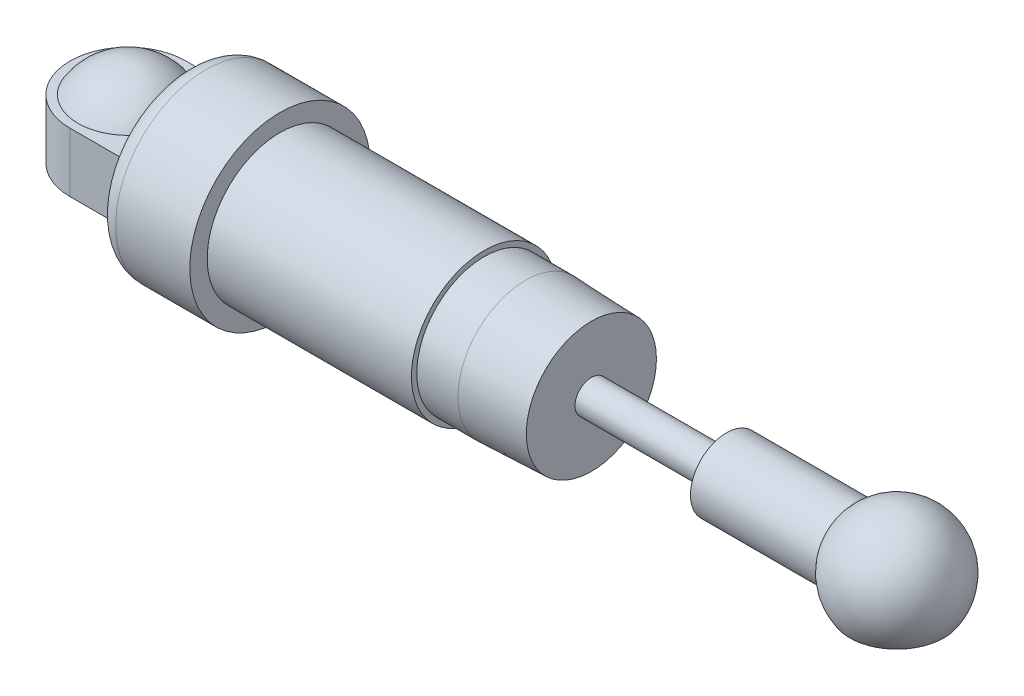
ISO-10303-21;
HEADER;
FILE_DESCRIPTION(('STEP AP214'),'2;1');
FILE_NAME('part.step','',(''),(''),'','','');
FILE_SCHEMA(('AUTOMOTIVE_DESIGN { 1 0 10303 214 1 1 1 1 }'));
ENDSEC;
DATA;
#1=APPLICATION_CONTEXT('core data for automotive mechanical design processes');
#2=APPLICATION_PROTOCOL_DEFINITION('international standard','automotive_design',2000,#1);
#3=PRODUCT_CONTEXT('',#1,'mechanical');
#4=PRODUCT('Part','Part','',(#3));
#5=PRODUCT_RELATED_PRODUCT_CATEGORY('part','',(#4));
#6=PRODUCT_DEFINITION_FORMATION('','',#4);
#7=PRODUCT_DEFINITION_CONTEXT('part definition',#1,'design');
#8=PRODUCT_DEFINITION('design','',#6,#7);
#9=PRODUCT_DEFINITION_SHAPE('','',#8);
#10=(LENGTH_UNIT() NAMED_UNIT(*) SI_UNIT(.MILLI.,.METRE.));
#11=(NAMED_UNIT(*) PLANE_ANGLE_UNIT() SI_UNIT($,.RADIAN.));
#12=(NAMED_UNIT(*) SI_UNIT($,.STERADIAN.) SOLID_ANGLE_UNIT());
#13=UNCERTAINTY_MEASURE_WITH_UNIT(LENGTH_MEASURE(1.E-05),#10,'distance_accuracy_value','');
#14=(GEOMETRIC_REPRESENTATION_CONTEXT(3) GLOBAL_UNCERTAINTY_ASSIGNED_CONTEXT((#13)) GLOBAL_UNIT_ASSIGNED_CONTEXT((#10,
#11,#12)) REPRESENTATION_CONTEXT('',''));
#15=CARTESIAN_POINT('',(0.,0.,0.));
#16=DIRECTION('',(0.,0.,1.));
#17=DIRECTION('',(1.,0.,0.));
#18=AXIS2_PLACEMENT_3D('',#15,#16,#17);
#19=CARTESIAN_POINT('',(-28.125,1.8,0.));
#20=DIRECTION('',(0.,1.,0.));
#21=DIRECTION('',(0.,0.,1.));
#22=AXIS2_PLACEMENT_3D('',#19,#20,#21);
#23=PLANE('',#22);
#24=DIRECTION('',(0.,0.,-1.));
#25=VECTOR('',#24,1.);
#26=CARTESIAN_POINT('',(-24.6,1.8,-3.525));
#27=LINE('',#26,#25);
#28=CARTESIAN_POINT('',(-24.6,1.8,3.525));
#29=VERTEX_POINT('',#28);
#30=CARTESIAN_POINT('',(-24.6,1.8,-3.525));
#31=VERTEX_POINT('',#30);
#32=EDGE_CURVE('E104',#29,#31,#27,.T.);
#33=ORIENTED_EDGE('',*,*,#32,.T.);
#34=DIRECTION('',(-1.,0.,0.));
#35=VECTOR('',#34,1.);
#36=CARTESIAN_POINT('',(-24.6,1.8,-3.525));
#37=LINE('',#36,#35);
#38=CARTESIAN_POINT('',(-28.125,1.8,-3.525));
#39=VERTEX_POINT('',#38);
#40=EDGE_CURVE('E107',#31,#39,#37,.T.);
#41=ORIENTED_EDGE('',*,*,#40,.T.);
#42=CARTESIAN_POINT('',(-28.125,1.8,0.));
#43=DIRECTION('',(0.,1.,0.));
#44=DIRECTION('',(0.,0.,1.));
#45=AXIS2_PLACEMENT_3D('',#42,#43,#44);
#46=CIRCLE('',#45,3.525);
#47=CARTESIAN_POINT('',(-28.125,1.8,3.525));
#48=VERTEX_POINT('',#47);
#49=EDGE_CURVE('E110',#39,#48,#46,.T.);
#50=ORIENTED_EDGE('',*,*,#49,.T.);
#51=DIRECTION('',(1.,0.,0.));
#52=VECTOR('',#51,1.);
#53=CARTESIAN_POINT('',(-24.6,1.8,3.525));
#54=LINE('',#53,#52);
#55=EDGE_CURVE('E112',#48,#29,#54,.T.);
#56=ORIENTED_EDGE('',*,*,#55,.T.);
#57=EDGE_LOOP('',(#33,#41,#50,#56));
#58=FACE_BOUND('',#57,.T.);
#59=CARTESIAN_POINT('',(-28.125,1.8,0.));
#60=DIRECTION('',(0.,1.,0.));
#61=DIRECTION('',(0.,0.,1.));
#62=AXIS2_PLACEMENT_3D('',#59,#60,#61);
#63=CIRCLE('',#62,3.03077960267651);
#64=CARTESIAN_POINT('',(-28.125,1.8,3.03077960267651));
#65=VERTEX_POINT('',#64);
#66=EDGE_CURVE('E39',#65,#65,#63,.F.);
#67=ORIENTED_EDGE('',*,*,#66,.T.);
#68=EDGE_LOOP('',(#67));
#69=FACE_BOUND('',#68,.T.);
#70=ADVANCED_FACE('F35',(#58,#69),#23,.T.);
#71=CARTESIAN_POINT('',(18.5394063644432,0.,0.));
#72=DIRECTION('',(-1.,0.,0.));
#73=DIRECTION('',(0.,1.,0.));
#74=AXIS2_PLACEMENT_3D('',#71,#72,#73);
#75=SPHERICAL_SURFACE('',#74,3.49);
#76=CARTESIAN_POINT('',(15.8140256570924,0.,0.));
#77=DIRECTION('',(-1.,0.,0.));
#78=DIRECTION('',(0.,0.,1.));
#79=AXIS2_PLACEMENT_3D('',#76,#77,#78);
#80=CIRCLE('',#79,2.18);
#81=CARTESIAN_POINT('',(15.8140256570924,-2.,0.867409937688057));
#82=VERTEX_POINT('',#81);
#83=CARTESIAN_POINT('',(15.8140256570924,-2.,-0.867409937688057));
#84=VERTEX_POINT('',#83);
#85=EDGE_CURVE('E147',#82,#84,#80,.T.);
#86=ORIENTED_EDGE('',*,*,#85,.F.);
#87=CARTESIAN_POINT('',(18.5394063644432,-2.,0.));
#88=DIRECTION('',(0.,-1.,0.));
#89=DIRECTION('',(1.,0.,0.));
#90=AXIS2_PLACEMENT_3D('',#87,#88,#89);
#91=CIRCLE('',#90,2.86008741125162);
#92=EDGE_CURVE('E11',#84,#82,#91,.T.);
#93=ORIENTED_EDGE('',*,*,#92,.F.);
#94=EDGE_LOOP('',(#86,#93));
#95=FACE_BOUND('',#94,.T.);
#96=ADVANCED_FACE('F180',(#95),#75,.T.);
#97=CARTESIAN_POINT('',(0.,0.,0.));
#98=DIRECTION('',(-1.,0.,0.));
#99=DIRECTION('',(0.,0.,1.));
#100=AXIS2_PLACEMENT_3D('',#97,#98,#99);
#101=CYLINDRICAL_SURFACE('',#100,2.18);
#102=CARTESIAN_POINT('',(8.19402565709242,0.,0.));
#103=DIRECTION('',(-1.,0.,0.));
#104=DIRECTION('',(0.,0.,1.));
#105=AXIS2_PLACEMENT_3D('',#102,#103,#104);
#106=CIRCLE('',#105,2.18);
#107=CARTESIAN_POINT('',(8.19402565709242,0.,2.18));
#108=VERTEX_POINT('',#107);
#109=EDGE_CURVE('E144',#108,#108,#106,.T.);
#110=ORIENTED_EDGE('',*,*,#109,.F.);
#111=EDGE_LOOP('',(#110));
#112=FACE_BOUND('',#111,.T.);
#113=ORIENTED_EDGE('',*,*,#85,.T.);
#114=CARTESIAN_POINT('',(38.1740256953523,0.,0.));
#115=DIRECTION('',(0.0890897673610199,-0.996023600800483,0.));
#116=DIRECTION('',(-0.996023600800483,-0.0890897673610199,0.));
#117=AXIS2_PLACEMENT_3D('',#114,#115,#116);
#118=ELLIPSE('',#117,24.4697013425341,2.18);
#119=EDGE_CURVE('E44',#82,#84,#118,.T.);
#120=ORIENTED_EDGE('',*,*,#119,.F.);
#121=EDGE_LOOP('',(#113,#120));
#122=FACE_BOUND('',#121,.T.);
#123=ADVANCED_FACE('F181',(#112,#122),#101,.T.);
#124=CARTESIAN_POINT('',(0.,3.95,0.));
#125=DIRECTION('',(1.,0.,0.));
#126=DIRECTION('',(0.,0.,-1.));
#127=AXIS2_PLACEMENT_3D('',#124,#125,#126);
#128=PLANE('',#127);
#129=CARTESIAN_POINT('',(0.,0.,0.));
#130=DIRECTION('',(1.,0.,0.));
#131=DIRECTION('',(0.,0.,-1.));
#132=AXIS2_PLACEMENT_3D('',#129,#130,#131);
#133=CIRCLE('',#132,3.95);
#134=CARTESIAN_POINT('',(0.,0.,-3.95));
#135=VERTEX_POINT('',#134);
#136=EDGE_CURVE('E171',#135,#135,#133,.T.);
#137=ORIENTED_EDGE('',*,*,#136,.T.);
#138=EDGE_LOOP('',(#137));
#139=FACE_BOUND('',#138,.T.);
#140=CARTESIAN_POINT('',(0.,0.,0.));
#141=DIRECTION('',(-1.,0.,0.));
#142=DIRECTION('',(0.,0.,1.));
#143=AXIS2_PLACEMENT_3D('',#140,#141,#142);
#144=CIRCLE('',#143,0.995);
#145=CARTESIAN_POINT('',(0.,0.,0.995));
#146=VERTEX_POINT('',#145);
#147=EDGE_CURVE('E138',#146,#146,#144,.T.);
#148=ORIENTED_EDGE('',*,*,#147,.T.);
#149=EDGE_LOOP('',(#148));
#150=FACE_BOUND('',#149,.T.);
#151=ADVANCED_FACE('F37',(#139,#150),#128,.T.);
#152=CARTESIAN_POINT('',(0.,0.,0.));
#153=DIRECTION('',(-1.,0.,0.));
#154=DIRECTION('',(0.,0.,1.));
#155=AXIS2_PLACEMENT_3D('',#152,#153,#154);
#156=CONICAL_SURFACE('',#155,3.95,0.037482436691661);
#157=CARTESIAN_POINT('',(-4.,0.,0.));
#158=DIRECTION('',(1.,0.,0.));
#159=DIRECTION('',(0.,0.,-1.));
#160=AXIS2_PLACEMENT_3D('',#157,#158,#159);
#161=CIRCLE('',#160,4.1);
#162=CARTESIAN_POINT('',(-4.,0.,-4.1));
#163=VERTEX_POINT('',#162);
#164=EDGE_CURVE('E168',#163,#163,#161,.T.);
#165=ORIENTED_EDGE('',*,*,#164,.T.);
#166=EDGE_LOOP('',(#165));
#167=FACE_BOUND('',#166,.T.);
#168=ORIENTED_EDGE('',*,*,#136,.F.);
#169=EDGE_LOOP('',(#168));
#170=FACE_BOUND('',#169,.T.);
#171=ADVANCED_FACE('F337',(#167,#170),#156,.T.);
#172=CARTESIAN_POINT('',(0.,0.,0.));
#173=DIRECTION('',(1.,0.,0.));
#174=DIRECTION('',(0.,0.,-1.));
#175=AXIS2_PLACEMENT_3D('',#172,#173,#174);
#176=CYLINDRICAL_SURFACE('',#175,4.1);
#177=CARTESIAN_POINT('',(-6.5,0.,0.));
#178=DIRECTION('',(1.,0.,0.));
#179=DIRECTION('',(0.,0.,-1.));
#180=AXIS2_PLACEMENT_3D('',#177,#178,#179);
#181=CIRCLE('',#180,4.1);
#182=CARTESIAN_POINT('',(-6.5,0.,-4.1));
#183=VERTEX_POINT('',#182);
#184=EDGE_CURVE('E165',#183,#183,#181,.T.);
#185=ORIENTED_EDGE('',*,*,#184,.T.);
#186=EDGE_LOOP('',(#185));
#187=FACE_BOUND('',#186,.T.);
#188=ORIENTED_EDGE('',*,*,#164,.F.);
#189=EDGE_LOOP('',(#188));
#190=FACE_BOUND('',#189,.T.);
#191=ADVANCED_FACE('F390',(#187,#190),#176,.T.);
#192=CARTESIAN_POINT('',(-6.5,4.42,0.));
#193=DIRECTION('',(1.,0.,0.));
#194=DIRECTION('',(0.,0.,-1.));
#195=AXIS2_PLACEMENT_3D('',#192,#193,#194);
#196=PLANE('',#195);
#197=CARTESIAN_POINT('',(-6.5,0.,0.));
#198=DIRECTION('',(1.,0.,0.));
#199=DIRECTION('',(0.,0.,-1.));
#200=AXIS2_PLACEMENT_3D('',#197,#198,#199);
#201=CIRCLE('',#200,4.42);
#202=CARTESIAN_POINT('',(-6.5,0.,-4.42));
#203=VERTEX_POINT('',#202);
#204=EDGE_CURVE('E162',#203,#203,#201,.T.);
#205=ORIENTED_EDGE('',*,*,#204,.T.);
#206=EDGE_LOOP('',(#205));
#207=FACE_BOUND('',#206,.T.);
#208=ORIENTED_EDGE('',*,*,#184,.F.);
#209=EDGE_LOOP('',(#208));
#210=FACE_BOUND('',#209,.T.);
#211=ADVANCED_FACE('F380',(#207,#210),#196,.T.);
#212=CARTESIAN_POINT('',(0.,0.,0.));
#213=DIRECTION('',(1.,0.,0.));
#214=DIRECTION('',(0.,0.,-1.));
#215=AXIS2_PLACEMENT_3D('',#212,#213,#214);
#216=CYLINDRICAL_SURFACE('',#215,4.42);
#217=CARTESIAN_POINT('',(-18.9,0.,0.));
#218=DIRECTION('',(1.,0.,0.));
#219=DIRECTION('',(0.,0.,-1.));
#220=AXIS2_PLACEMENT_3D('',#217,#218,#219);
#221=CIRCLE('',#220,4.42);
#222=CARTESIAN_POINT('',(-18.9,0.,-4.42));
#223=VERTEX_POINT('',#222);
#224=EDGE_CURVE('E159',#223,#223,#221,.T.);
#225=ORIENTED_EDGE('',*,*,#224,.T.);
#226=EDGE_LOOP('',(#225));
#227=FACE_BOUND('',#226,.T.);
#228=ORIENTED_EDGE('',*,*,#204,.F.);
#229=EDGE_LOOP('',(#228));
#230=FACE_BOUND('',#229,.T.);
#231=ADVANCED_FACE('F371',(#227,#230),#216,.T.);
#232=CARTESIAN_POINT('',(-18.9,5.475,0.));
#233=DIRECTION('',(1.,0.,0.));
#234=DIRECTION('',(0.,0.,-1.));
#235=AXIS2_PLACEMENT_3D('',#232,#233,#234);
#236=PLANE('',#235);
#237=CARTESIAN_POINT('',(-18.9,0.,0.));
#238=DIRECTION('',(1.,0.,0.));
#239=DIRECTION('',(0.,0.,-1.));
#240=AXIS2_PLACEMENT_3D('',#237,#238,#239);
#241=CIRCLE('',#240,5.475);
#242=CARTESIAN_POINT('',(-18.9,0.,-5.475));
#243=VERTEX_POINT('',#242);
#244=EDGE_CURVE('E156',#243,#243,#241,.T.);
#245=ORIENTED_EDGE('',*,*,#244,.T.);
#246=EDGE_LOOP('',(#245));
#247=FACE_BOUND('',#246,.T.);
#248=ORIENTED_EDGE('',*,*,#224,.F.);
#249=EDGE_LOOP('',(#248));
#250=FACE_BOUND('',#249,.T.);
#251=ADVANCED_FACE('F362',(#247,#250),#236,.T.);
#252=CARTESIAN_POINT('',(0.,0.,0.));
#253=DIRECTION('',(1.,0.,0.));
#254=DIRECTION('',(0.,0.,-1.));
#255=AXIS2_PLACEMENT_3D('',#252,#253,#254);
#256=CYLINDRICAL_SURFACE('',#255,5.475);
#257=CARTESIAN_POINT('',(-23.4,0.,0.));
#258=DIRECTION('',(1.,0.,0.));
#259=DIRECTION('',(0.,0.,-1.));
#260=AXIS2_PLACEMENT_3D('',#257,#258,#259);
#261=CIRCLE('',#260,5.475);
#262=CARTESIAN_POINT('',(-23.4,0.,-5.475));
#263=VERTEX_POINT('',#262);
#264=EDGE_CURVE('E153',#263,#263,#261,.T.);
#265=ORIENTED_EDGE('',*,*,#264,.T.);
#266=EDGE_LOOP('',(#265));
#267=FACE_BOUND('',#266,.T.);
#268=ORIENTED_EDGE('',*,*,#244,.F.);
#269=EDGE_LOOP('',(#268));
#270=FACE_BOUND('',#269,.T.);
#271=ADVANCED_FACE('F353',(#267,#270),#256,.T.);
#272=CARTESIAN_POINT('',(-23.4,0.,0.));
#273=DIRECTION('',(1.,0.,0.));
#274=DIRECTION('',(0.,0.,-1.));
#275=AXIS2_PLACEMENT_3D('',#272,#273,#274);
#276=TOROIDAL_SURFACE('',#275,4.275,1.2);
#277=CARTESIAN_POINT('',(-24.6,0.,0.));
#278=DIRECTION('',(1.,0.,0.));
#279=DIRECTION('',(0.,0.,-1.));
#280=AXIS2_PLACEMENT_3D('',#277,#278,#279);
#281=CIRCLE('',#280,4.275);
#282=CARTESIAN_POINT('',(-24.6,0.,-4.275));
#283=VERTEX_POINT('',#282);
#284=EDGE_CURVE('E150',#283,#283,#281,.T.);
#285=ORIENTED_EDGE('',*,*,#284,.T.);
#286=EDGE_LOOP('',(#285));
#287=FACE_BOUND('',#286,.T.);
#288=ORIENTED_EDGE('',*,*,#264,.F.);
#289=EDGE_LOOP('',(#288));
#290=FACE_BOUND('',#289,.T.);
#291=ADVANCED_FACE('F345',(#287,#290),#276,.T.);
#292=CARTESIAN_POINT('',(-24.6,4.275,0.));
#293=DIRECTION('',(-1.,0.,0.));
#294=DIRECTION('',(0.,0.,1.));
#295=AXIS2_PLACEMENT_3D('',#292,#293,#294);
#296=PLANE('',#295);
#297=ORIENTED_EDGE('',*,*,#32,.F.);
#298=DIRECTION('',(0.,-1.,0.));
#299=VECTOR('',#298,1.);
#300=CARTESIAN_POINT('',(-24.6,1.8,3.525));
#301=LINE('',#300,#299);
#302=CARTESIAN_POINT('',(-24.6,-1.8,3.525));
#303=VERTEX_POINT('',#302);
#304=EDGE_CURVE('E114',#29,#303,#301,.T.);
#305=ORIENTED_EDGE('',*,*,#304,.T.);
#306=DIRECTION('',(0.,0.,-1.));
#307=VECTOR('',#306,1.);
#308=CARTESIAN_POINT('',(-24.6,-1.8,-3.525));
#309=LINE('',#308,#307);
#310=CARTESIAN_POINT('',(-24.6,-1.8,-3.525));
#311=VERTEX_POINT('',#310);
#312=EDGE_CURVE('E100',#303,#311,#309,.T.);
#313=ORIENTED_EDGE('',*,*,#312,.T.);
#314=DIRECTION('',(0.,-1.,0.));
#315=VECTOR('',#314,1.);
#316=CARTESIAN_POINT('',(-24.6,1.8,-3.525));
#317=LINE('',#316,#315);
#318=EDGE_CURVE('E51',#31,#311,#317,.T.);
#319=ORIENTED_EDGE('',*,*,#318,.F.);
#320=EDGE_LOOP('',(#297,#305,#313,#319));
#321=FACE_BOUND('',#320,.T.);
#322=ORIENTED_EDGE('',*,*,#284,.F.);
#323=EDGE_LOOP('',(#322));
#324=FACE_BOUND('',#323,.T.);
#325=ADVANCED_FACE('F328',(#321,#324),#296,.T.);
#326=CARTESIAN_POINT('',(8.19402565709242,0.995,0.));
#327=DIRECTION('',(1.,0.,0.));
#328=DIRECTION('',(0.,0.,-1.));
#329=AXIS2_PLACEMENT_3D('',#326,#327,#328);
#330=PLANE('',#329);
#331=CARTESIAN_POINT('',(8.19402565709242,0.,0.));
#332=DIRECTION('',(-1.,0.,0.));
#333=DIRECTION('',(0.,0.,1.));
#334=AXIS2_PLACEMENT_3D('',#331,#332,#333);
#335=CIRCLE('',#334,0.995);
#336=CARTESIAN_POINT('',(8.19402565709242,0.,0.995));
#337=VERTEX_POINT('',#336);
#338=EDGE_CURVE('E141',#337,#337,#335,.T.);
#339=ORIENTED_EDGE('',*,*,#338,.F.);
#340=EDGE_LOOP('',(#339));
#341=FACE_BOUND('',#340,.T.);
#342=ORIENTED_EDGE('',*,*,#109,.T.);
#343=EDGE_LOOP('',(#342));
#344=FACE_BOUND('',#343,.T.);
#345=ADVANCED_FACE('F193',(#341,#344),#330,.F.);
#346=CARTESIAN_POINT('',(0.,0.,0.));
#347=DIRECTION('',(-1.,0.,0.));
#348=DIRECTION('',(0.,0.,1.));
#349=AXIS2_PLACEMENT_3D('',#346,#347,#348);
#350=CYLINDRICAL_SURFACE('',#349,0.995);
#351=ORIENTED_EDGE('',*,*,#147,.F.);
#352=EDGE_LOOP('',(#351));
#353=FACE_BOUND('',#352,.T.);
#354=ORIENTED_EDGE('',*,*,#338,.T.);
#355=EDGE_LOOP('',(#354));
#356=FACE_BOUND('',#355,.T.);
#357=ADVANCED_FACE('F184',(#353,#356),#350,.T.);
#358=CARTESIAN_POINT('',(21.3994937756949,-2.,66.3544477055751));
#359=DIRECTION('',(0.,-1.,0.));
#360=DIRECTION('',(1.,0.,0.));
#361=AXIS2_PLACEMENT_3D('',#358,#359,#360);
#362=PLANE('',#361);
#363=CARTESIAN_POINT('',(18.5394063644432,-2.,0.));
#364=DIRECTION('',(0.,-1.,0.));
#365=DIRECTION('',(0.,0.,-1.));
#366=AXIS2_PLACEMENT_3D('',#363,#364,#365);
#367=CIRCLE('',#366,2.04999999999999);
#368=CARTESIAN_POINT('',(18.5394063644432,-2.,-2.04999999999999));
#369=VERTEX_POINT('',#368);
#370=EDGE_CURVE('E130',#369,#369,#367,.T.);
#371=ORIENTED_EDGE('',*,*,#370,.F.);
#372=EDGE_LOOP('',(#371));
#373=FACE_BOUND('',#372,.T.);
#374=ORIENTED_EDGE('',*,*,#92,.T.);
#375=DIRECTION('',(0.,0.,-1.));
#376=VECTOR('',#375,1.);
#377=CARTESIAN_POINT('',(15.8140256570924,-2.,66.3544477055751));
#378=LINE('',#377,#376);
#379=EDGE_CURVE('E136',#82,#84,#378,.T.);
#380=ORIENTED_EDGE('',*,*,#379,.T.);
#381=EDGE_LOOP('',(#374,#380));
#382=FACE_BOUND('',#381,.T.);
#383=ADVANCED_FACE('F182',(#373,#382),#362,.T.);
#384=CARTESIAN_POINT('',(15.8140256570924,-2.,66.3544477055751));
#385=DIRECTION('',(0.0890897673610199,-0.996023600800483,0.));
#386=DIRECTION('',(0.996023600800483,0.0890897673610199,0.));
#387=AXIS2_PLACEMENT_3D('',#384,#385,#386);
#388=PLANE('',#387);
#389=ORIENTED_EDGE('',*,*,#119,.T.);
#390=ORIENTED_EDGE('',*,*,#379,.F.);
#391=EDGE_LOOP('',(#389,#390));
#392=FACE_BOUND('',#391,.T.);
#393=ADVANCED_FACE('F176',(#392),#388,.T.);
#394=CARTESIAN_POINT('',(18.5394063644432,1.91,0.));
#395=DIRECTION('',(0.,-1.,0.));
#396=DIRECTION('',(0.,0.,-1.));
#397=AXIS2_PLACEMENT_3D('',#394,#395,#396);
#398=CONICAL_SURFACE('',#397,2.04999999999999,1.02974425867665);
#399=CARTESIAN_POINT('',(18.5394063644432,3.1417642690065,0.));
#400=VERTEX_POINT('',#399);
#401=VERTEX_LOOP('',#400);
#402=FACE_BOUND('',#401,.T.);
#403=CARTESIAN_POINT('',(18.5394063644432,1.91,0.));
#404=DIRECTION('',(0.,-1.,0.));
#405=DIRECTION('',(0.,0.,-1.));
#406=AXIS2_PLACEMENT_3D('',#403,#404,#405);
#407=CIRCLE('',#406,2.04999999999999);
#408=CARTESIAN_POINT('',(18.5394063644432,1.91,-2.04999999999999));
#409=VERTEX_POINT('',#408);
#410=EDGE_CURVE('E133',#409,#409,#407,.T.);
#411=ORIENTED_EDGE('',*,*,#410,.T.);
#412=EDGE_LOOP('',(#411));
#413=FACE_BOUND('',#412,.T.);
#414=ADVANCED_FACE('F191',(#402,#413),#398,.F.);
#415=CARTESIAN_POINT('',(18.5394063644432,-2.,0.));
#416=DIRECTION('',(0.,-1.,0.));
#417=DIRECTION('',(0.,0.,-1.));
#418=AXIS2_PLACEMENT_3D('',#415,#416,#417);
#419=CYLINDRICAL_SURFACE('',#418,2.04999999999999);
#420=ORIENTED_EDGE('',*,*,#410,.F.);
#421=EDGE_LOOP('',(#420));
#422=FACE_BOUND('',#421,.T.);
#423=ORIENTED_EDGE('',*,*,#370,.T.);
#424=EDGE_LOOP('',(#423));
#425=FACE_BOUND('',#424,.T.);
#426=ADVANCED_FACE('F222',(#422,#425),#419,.F.);
#427=CARTESIAN_POINT('',(-24.6,1.8,-3.525));
#428=DIRECTION('',(0.,0.,1.));
#429=DIRECTION('',(1.,0.,0.));
#430=AXIS2_PLACEMENT_3D('',#427,#428,#429);
#431=PLANE('',#430);
#432=DIRECTION('',(-1.,0.,0.));
#433=VECTOR('',#432,1.);
#434=CARTESIAN_POINT('',(-24.6,-1.8,-3.525));
#435=LINE('',#434,#433);
#436=CARTESIAN_POINT('',(-28.125,-1.8,-3.525));
#437=VERTEX_POINT('',#436);
#438=EDGE_CURVE('E117',#311,#437,#435,.T.);
#439=ORIENTED_EDGE('',*,*,#438,.T.);
#440=DIRECTION('',(0.,-1.,0.));
#441=VECTOR('',#440,1.);
#442=CARTESIAN_POINT('',(-28.125,1.8,-3.525));
#443=LINE('',#442,#441);
#444=EDGE_CURVE('E127',#39,#437,#443,.T.);
#445=ORIENTED_EDGE('',*,*,#444,.F.);
#446=ORIENTED_EDGE('',*,*,#40,.F.);
#447=ORIENTED_EDGE('',*,*,#318,.T.);
#448=EDGE_LOOP('',(#439,#445,#446,#447));
#449=FACE_BOUND('',#448,.T.);
#450=ADVANCED_FACE('F218',(#449),#431,.F.);
#451=CARTESIAN_POINT('',(-28.125,1.8,0.));
#452=DIRECTION('',(0.,-1.,0.));
#453=DIRECTION('',(0.,0.,-1.));
#454=AXIS2_PLACEMENT_3D('',#451,#452,#453);
#455=CYLINDRICAL_SURFACE('',#454,3.525);
#456=CARTESIAN_POINT('',(-28.125,-1.8,0.));
#457=DIRECTION('',(0.,1.,0.));
#458=DIRECTION('',(0.,0.,1.));
#459=AXIS2_PLACEMENT_3D('',#456,#457,#458);
#460=CIRCLE('',#459,3.525);
#461=CARTESIAN_POINT('',(-28.125,-1.8,3.525));
#462=VERTEX_POINT('',#461);
#463=EDGE_CURVE('E119',#437,#462,#460,.T.);
#464=ORIENTED_EDGE('',*,*,#463,.T.);
#465=DIRECTION('',(0.,-1.,0.));
#466=VECTOR('',#465,1.);
#467=CARTESIAN_POINT('',(-28.125,1.8,3.525));
#468=LINE('',#467,#466);
#469=EDGE_CURVE('E125',#48,#462,#468,.T.);
#470=ORIENTED_EDGE('',*,*,#469,.F.);
#471=ORIENTED_EDGE('',*,*,#49,.F.);
#472=ORIENTED_EDGE('',*,*,#444,.T.);
#473=EDGE_LOOP('',(#464,#470,#471,#472));
#474=FACE_BOUND('',#473,.T.);
#475=ADVANCED_FACE('F214',(#474),#455,.T.);
#476=CARTESIAN_POINT('',(-24.6,1.8,3.525));
#477=DIRECTION('',(0.,0.,-1.));
#478=DIRECTION('',(-1.,0.,0.));
#479=AXIS2_PLACEMENT_3D('',#476,#477,#478);
#480=PLANE('',#479);
#481=DIRECTION('',(1.,0.,0.));
#482=VECTOR('',#481,1.);
#483=CARTESIAN_POINT('',(-24.6,-1.8,3.525));
#484=LINE('',#483,#482);
#485=EDGE_CURVE('E108',#462,#303,#484,.T.);
#486=ORIENTED_EDGE('',*,*,#485,.T.);
#487=ORIENTED_EDGE('',*,*,#304,.F.);
#488=ORIENTED_EDGE('',*,*,#55,.F.);
#489=ORIENTED_EDGE('',*,*,#469,.T.);
#490=EDGE_LOOP('',(#486,#487,#488,#489));
#491=FACE_BOUND('',#490,.T.);
#492=ADVANCED_FACE('F210',(#491),#480,.F.);
#493=CARTESIAN_POINT('',(-28.125,-1.8,0.));
#494=DIRECTION('',(0.,1.,0.));
#495=DIRECTION('',(0.,0.,1.));
#496=AXIS2_PLACEMENT_3D('',#493,#494,#495);
#497=PLANE('',#496);
#498=CARTESIAN_POINT('',(-28.125,-1.8,0.));
#499=DIRECTION('',(0.,-1.,0.));
#500=DIRECTION('',(0.,0.,-1.));
#501=AXIS2_PLACEMENT_3D('',#498,#499,#500);
#502=CIRCLE('',#501,2.04999999999999);
#503=CARTESIAN_POINT('',(-28.125,-1.8,-2.04999999999999));
#504=VERTEX_POINT('',#503);
#505=EDGE_CURVE('E97',#504,#504,#502,.T.);
#506=ORIENTED_EDGE('',*,*,#505,.F.);
#507=EDGE_LOOP('',(#506));
#508=FACE_BOUND('',#507,.T.);
#509=ORIENTED_EDGE('',*,*,#312,.F.);
#510=ORIENTED_EDGE('',*,*,#485,.F.);
#511=ORIENTED_EDGE('',*,*,#463,.F.);
#512=ORIENTED_EDGE('',*,*,#438,.F.);
#513=EDGE_LOOP('',(#509,#510,#511,#512));
#514=FACE_BOUND('',#513,.T.);
#515=ADVANCED_FACE('F207',(#508,#514),#497,.F.);
#516=CARTESIAN_POINT('',(-28.125,0.,0.));
#517=DIRECTION('',(-1.,0.,0.));
#518=DIRECTION('',(0.,0.,1.));
#519=AXIS2_PLACEMENT_3D('',#516,#517,#518);
#520=SPHERICAL_SURFACE('',#519,3.525);
#521=CARTESIAN_POINT('',(-28.125,0.,0.));
#522=DIRECTION('',(0.,1.,0.));
#523=DIRECTION('',(0.,0.,1.));
#524=AXIS2_PLACEMENT_3D('',#521,#522,#523);
#525=SPHERICAL_SURFACE('',#524,3.525);
#526=ORIENTED_EDGE('',*,*,#66,.F.);
#527=EDGE_LOOP('',(#526));
#528=FACE_BOUND('',#527,.T.);
#529=ADVANCED_FACE('F91',(#528),#525,.T.);
#530=CARTESIAN_POINT('',(-28.125,2.11,0.));
#531=DIRECTION('',(0.,-1.,0.));
#532=DIRECTION('',(0.,0.,-1.));
#533=AXIS2_PLACEMENT_3D('',#530,#531,#532);
#534=CONICAL_SURFACE('',#533,2.04999999999999,1.02974425867665);
#535=CARTESIAN_POINT('',(-28.125,3.3417642690065,0.));
#536=VERTEX_POINT('',#535);
#537=VERTEX_LOOP('',#536);
#538=FACE_BOUND('',#537,.T.);
#539=CARTESIAN_POINT('',(-28.125,2.11,0.));
#540=DIRECTION('',(0.,-1.,0.));
#541=DIRECTION('',(0.,0.,-1.));
#542=AXIS2_PLACEMENT_3D('',#539,#540,#541);
#543=CIRCLE('',#542,2.04999999999999);
#544=CARTESIAN_POINT('',(-28.125,2.11,-2.04999999999999));
#545=VERTEX_POINT('',#544);
#546=EDGE_CURVE('E95',#545,#545,#543,.T.);
#547=ORIENTED_EDGE('',*,*,#546,.T.);
#548=EDGE_LOOP('',(#547));
#549=FACE_BOUND('',#548,.T.);
#550=ADVANCED_FACE('F87',(#538,#549),#534,.F.);
#551=CARTESIAN_POINT('',(-28.125,-1.8,0.));
#552=DIRECTION('',(0.,-1.,0.));
#553=DIRECTION('',(0.,0.,-1.));
#554=AXIS2_PLACEMENT_3D('',#551,#552,#553);
#555=CYLINDRICAL_SURFACE('',#554,2.04999999999999);
#556=ORIENTED_EDGE('',*,*,#546,.F.);
#557=EDGE_LOOP('',(#556));
#558=FACE_BOUND('',#557,.T.);
#559=ORIENTED_EDGE('',*,*,#505,.T.);
#560=EDGE_LOOP('',(#559));
#561=FACE_BOUND('',#560,.T.);
#562=ADVANCED_FACE('F90',(#558,#561),#555,.F.);
#563=CLOSED_SHELL('',(#70,#96,#123,#151,#171,#191,#211,#231,#251,#271,#291,#325,#345,#357,#383,
#393,#414,#426,#450,#475,#492,#515,#529,#550,#562));
#564=MANIFOLD_SOLID_BREP('B2',#563);
#565=ADVANCED_BREP_SHAPE_REPRESENTATION('',(#18,#564),#14);
#566=SHAPE_DEFINITION_REPRESENTATION(#9,#565);
ENDSEC;
END-ISO-10303-21;
